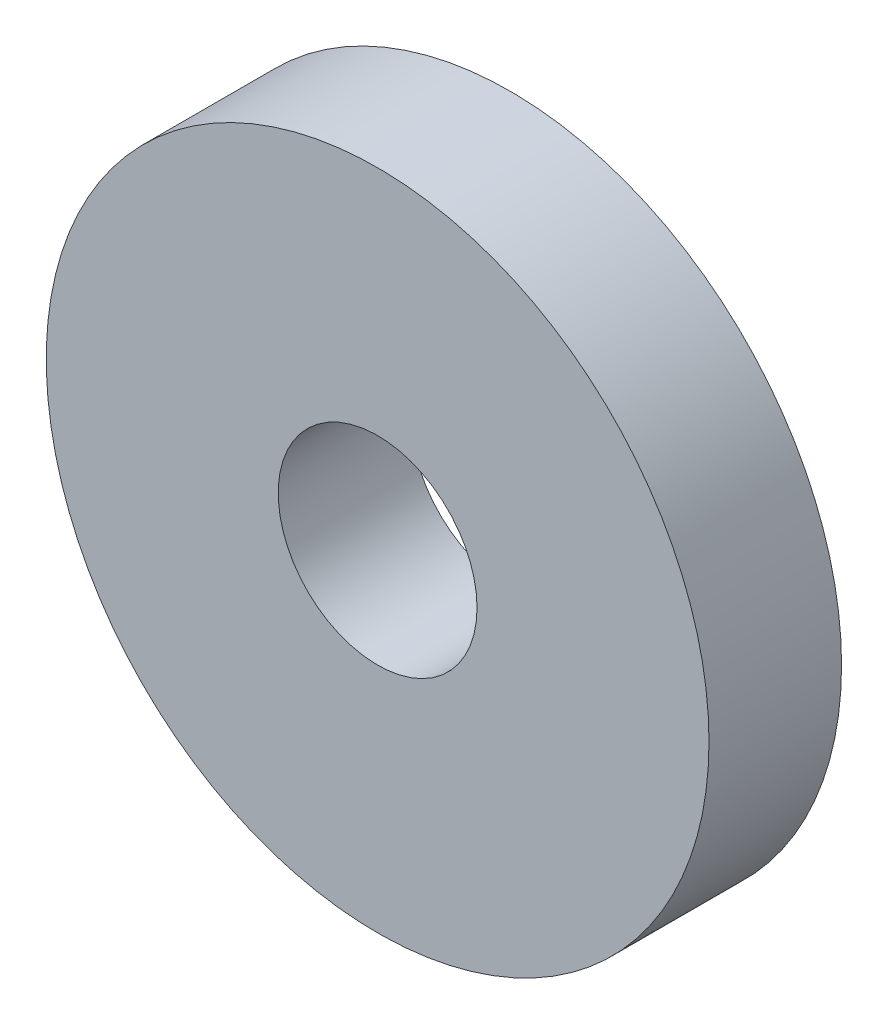
ISO-10303-21;
HEADER;
FILE_DESCRIPTION(('STEP AP214'),'2;1');
FILE_NAME('part.step','',(''),(''),'','','');
FILE_SCHEMA(('AUTOMOTIVE_DESIGN { 1 0 10303 214 1 1 1 1 }'));
ENDSEC;
DATA;
#1=APPLICATION_CONTEXT('core data for automotive mechanical design processes');
#2=APPLICATION_PROTOCOL_DEFINITION('international standard','automotive_design',2000,#1);
#3=PRODUCT_CONTEXT('',#1,'mechanical');
#4=PRODUCT('Part','Part','',(#3));
#5=PRODUCT_RELATED_PRODUCT_CATEGORY('part','',(#4));
#6=PRODUCT_DEFINITION_FORMATION('','',#4);
#7=PRODUCT_DEFINITION_CONTEXT('part definition',#1,'design');
#8=PRODUCT_DEFINITION('design','',#6,#7);
#9=PRODUCT_DEFINITION_SHAPE('','',#8);
#10=(LENGTH_UNIT() NAMED_UNIT(*) SI_UNIT(.MILLI.,.METRE.));
#11=(NAMED_UNIT(*) PLANE_ANGLE_UNIT() SI_UNIT($,.RADIAN.));
#12=(NAMED_UNIT(*) SI_UNIT($,.STERADIAN.) SOLID_ANGLE_UNIT());
#13=UNCERTAINTY_MEASURE_WITH_UNIT(LENGTH_MEASURE(1.E-05),#10,'distance_accuracy_value','');
#14=(GEOMETRIC_REPRESENTATION_CONTEXT(3) GLOBAL_UNCERTAINTY_ASSIGNED_CONTEXT((#13)) GLOBAL_UNIT_ASSIGNED_CONTEXT((#10,
#11,#12)) REPRESENTATION_CONTEXT('',''));
#15=CARTESIAN_POINT('',(0.,0.,0.));
#16=DIRECTION('',(0.,0.,1.));
#17=DIRECTION('',(1.,0.,0.));
#18=AXIS2_PLACEMENT_3D('',#15,#16,#17);
#19=CARTESIAN_POINT('',(4.37947672438398,-5.57853054279806,2.));
#20=DIRECTION('',(0.,0.,1.));
#21=DIRECTION('',(1.,0.,0.));
#22=AXIS2_PLACEMENT_3D('',#19,#20,#21);
#23=PLANE('',#22);
#24=CARTESIAN_POINT('',(4.37947672438398,-5.57853054279806,2.));
#25=DIRECTION('',(0.,0.,1.));
#26=DIRECTION('',(1.,0.,0.));
#27=AXIS2_PLACEMENT_3D('',#24,#25,#26);
#28=CIRCLE('',#27,5.);
#29=CARTESIAN_POINT('',(9.37947672438398,-5.57853054279806,2.));
#30=VERTEX_POINT('',#29);
#31=EDGE_CURVE('E10',#30,#30,#28,.T.);
#32=ORIENTED_EDGE('',*,*,#31,.T.);
#33=EDGE_LOOP('',(#32));
#34=FACE_BOUND('',#33,.T.);
#35=CARTESIAN_POINT('',(4.37947672438398,-5.57853054279806,2.));
#36=DIRECTION('',(0.,0.,1.));
#37=DIRECTION('',(1.,0.,0.));
#38=AXIS2_PLACEMENT_3D('',#35,#36,#37);
#39=CIRCLE('',#38,1.5);
#40=CARTESIAN_POINT('',(5.87947672438398,-5.57853054279806,2.));
#41=VERTEX_POINT('',#40);
#42=EDGE_CURVE('E45',#41,#41,#39,.T.);
#43=ORIENTED_EDGE('',*,*,#42,.F.);
#44=EDGE_LOOP('',(#43));
#45=FACE_BOUND('',#44,.T.);
#46=ADVANCED_FACE('F34',(#34,#45),#23,.T.);
#47=CARTESIAN_POINT('',(4.37947672438398,-5.57853054279806,0.));
#48=DIRECTION('',(0.,0.,1.));
#49=DIRECTION('',(1.,0.,0.));
#50=AXIS2_PLACEMENT_3D('',#47,#48,#49);
#51=PLANE('',#50);
#52=CARTESIAN_POINT('',(4.37947672438398,-5.57853054279806,0.));
#53=DIRECTION('',(0.,0.,1.));
#54=DIRECTION('',(1.,0.,0.));
#55=AXIS2_PLACEMENT_3D('',#52,#53,#54);
#56=CIRCLE('',#55,5.);
#57=CARTESIAN_POINT('',(9.37947672438398,-5.57853054279806,0.));
#58=VERTEX_POINT('',#57);
#59=EDGE_CURVE('E38',#58,#58,#56,.T.);
#60=ORIENTED_EDGE('',*,*,#59,.F.);
#61=EDGE_LOOP('',(#60));
#62=FACE_BOUND('',#61,.T.);
#63=CARTESIAN_POINT('',(4.37947672438398,-5.57853054279806,0.));
#64=DIRECTION('',(0.,0.,1.));
#65=DIRECTION('',(1.,0.,0.));
#66=AXIS2_PLACEMENT_3D('',#63,#64,#65);
#67=CIRCLE('',#66,1.5);
#68=CARTESIAN_POINT('',(5.87947672438398,-5.57853054279806,0.));
#69=VERTEX_POINT('',#68);
#70=EDGE_CURVE('E47',#69,#69,#67,.T.);
#71=ORIENTED_EDGE('',*,*,#70,.T.);
#72=EDGE_LOOP('',(#71));
#73=FACE_BOUND('',#72,.T.);
#74=ADVANCED_FACE('F57',(#62,#73),#51,.F.);
#75=CARTESIAN_POINT('',(4.37947672438398,-5.57853054279806,2.));
#76=DIRECTION('',(0.,0.,-1.));
#77=DIRECTION('',(-1.,0.,0.));
#78=AXIS2_PLACEMENT_3D('',#75,#76,#77);
#79=CYLINDRICAL_SURFACE('',#78,5.);
#80=ORIENTED_EDGE('',*,*,#31,.F.);
#81=EDGE_LOOP('',(#80));
#82=FACE_BOUND('',#81,.T.);
#83=ORIENTED_EDGE('',*,*,#59,.T.);
#84=EDGE_LOOP('',(#83));
#85=FACE_BOUND('',#84,.T.);
#86=ADVANCED_FACE('F36',(#82,#85),#79,.T.);
#87=CARTESIAN_POINT('',(4.37947672438398,-5.57853054279806,2.));
#88=DIRECTION('',(0.,0.,-1.));
#89=DIRECTION('',(-1.,0.,0.));
#90=AXIS2_PLACEMENT_3D('',#87,#88,#89);
#91=CYLINDRICAL_SURFACE('',#90,1.5);
#92=ORIENTED_EDGE('',*,*,#42,.T.);
#93=EDGE_LOOP('',(#92));
#94=FACE_BOUND('',#93,.T.);
#95=ORIENTED_EDGE('',*,*,#70,.F.);
#96=EDGE_LOOP('',(#95));
#97=FACE_BOUND('',#96,.T.);
#98=ADVANCED_FACE('F53',(#94,#97),#91,.F.);
#99=CLOSED_SHELL('',(#46,#74,#86,#98));
#100=MANIFOLD_SOLID_BREP('B2',#99);
#101=ADVANCED_BREP_SHAPE_REPRESENTATION('',(#18,#100),#14);
#102=SHAPE_DEFINITION_REPRESENTATION(#9,#101);
ENDSEC;
END-ISO-10303-21;
